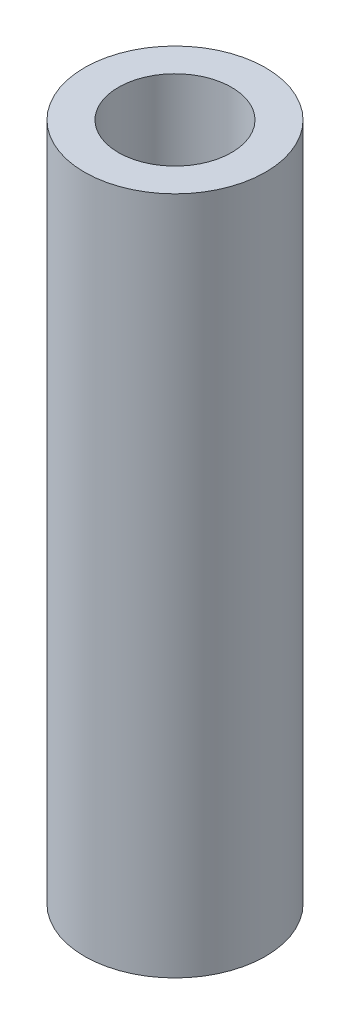
ISO-10303-21;
HEADER;
FILE_DESCRIPTION(('STEP AP214'),'2;1');
FILE_NAME('part.step','',(''),(''),'','','');
FILE_SCHEMA(('AUTOMOTIVE_DESIGN { 1 0 10303 214 1 1 1 1 }'));
ENDSEC;
DATA;
#1=APPLICATION_CONTEXT('core data for automotive mechanical design processes');
#2=APPLICATION_PROTOCOL_DEFINITION('international standard','automotive_design',2000,#1);
#3=PRODUCT_CONTEXT('',#1,'mechanical');
#4=PRODUCT('Part','Part','',(#3));
#5=PRODUCT_RELATED_PRODUCT_CATEGORY('part','',(#4));
#6=PRODUCT_DEFINITION_FORMATION('','',#4);
#7=PRODUCT_DEFINITION_CONTEXT('part definition',#1,'design');
#8=PRODUCT_DEFINITION('design','',#6,#7);
#9=PRODUCT_DEFINITION_SHAPE('','',#8);
#10=(LENGTH_UNIT() NAMED_UNIT(*) SI_UNIT(.MILLI.,.METRE.));
#11=(NAMED_UNIT(*) PLANE_ANGLE_UNIT() SI_UNIT($,.RADIAN.));
#12=(NAMED_UNIT(*) SI_UNIT($,.STERADIAN.) SOLID_ANGLE_UNIT());
#13=UNCERTAINTY_MEASURE_WITH_UNIT(LENGTH_MEASURE(1.E-05),#10,'distance_accuracy_value','');
#14=(GEOMETRIC_REPRESENTATION_CONTEXT(3) GLOBAL_UNCERTAINTY_ASSIGNED_CONTEXT((#13)) GLOBAL_UNIT_ASSIGNED_CONTEXT((#10,
#11,#12)) REPRESENTATION_CONTEXT('',''));
#15=CARTESIAN_POINT('',(0.,0.,0.));
#16=DIRECTION('',(0.,0.,1.));
#17=DIRECTION('',(1.,0.,0.));
#18=AXIS2_PLACEMENT_3D('',#15,#16,#17);
#19=CARTESIAN_POINT('',(0.,15.,0.));
#20=DIRECTION('',(0.,1.,0.));
#21=DIRECTION('',(0.,0.,1.));
#22=AXIS2_PLACEMENT_3D('',#19,#20,#21);
#23=PLANE('',#22);
#24=CARTESIAN_POINT('',(0.,15.,0.));
#25=DIRECTION('',(0.,1.,0.));
#26=DIRECTION('',(0.,0.,1.));
#27=AXIS2_PLACEMENT_3D('',#24,#25,#26);
#28=CIRCLE('',#27,2.);
#29=CARTESIAN_POINT('',(0.,15.,2.));
#30=VERTEX_POINT('',#29);
#31=EDGE_CURVE('E10',#30,#30,#28,.T.);
#32=ORIENTED_EDGE('',*,*,#31,.T.);
#33=EDGE_LOOP('',(#32));
#34=FACE_BOUND('',#33,.T.);
#35=CARTESIAN_POINT('',(0.,15.,0.));
#36=DIRECTION('',(0.,1.,0.));
#37=DIRECTION('',(0.,0.,1.));
#38=AXIS2_PLACEMENT_3D('',#35,#36,#37);
#39=CIRCLE('',#38,1.25);
#40=CARTESIAN_POINT('',(0.,15.,1.25));
#41=VERTEX_POINT('',#40);
#42=EDGE_CURVE('E53',#41,#41,#39,.T.);
#43=ORIENTED_EDGE('',*,*,#42,.F.);
#44=EDGE_LOOP('',(#43));
#45=FACE_BOUND('',#44,.T.);
#46=ADVANCED_FACE('F40',(#34,#45),#23,.T.);
#47=CARTESIAN_POINT('',(0.,0.,0.));
#48=DIRECTION('',(0.,1.,0.));
#49=DIRECTION('',(0.,0.,1.));
#50=AXIS2_PLACEMENT_3D('',#47,#48,#49);
#51=PLANE('',#50);
#52=CARTESIAN_POINT('',(0.,0.,0.));
#53=DIRECTION('',(0.,1.,0.));
#54=DIRECTION('',(0.,0.,1.));
#55=AXIS2_PLACEMENT_3D('',#52,#53,#54);
#56=CIRCLE('',#55,2.);
#57=CARTESIAN_POINT('',(0.,0.,2.));
#58=VERTEX_POINT('',#57);
#59=EDGE_CURVE('E44',#58,#58,#56,.T.);
#60=ORIENTED_EDGE('',*,*,#59,.F.);
#61=EDGE_LOOP('',(#60));
#62=FACE_BOUND('',#61,.T.);
#63=CARTESIAN_POINT('',(0.,0.,0.));
#64=DIRECTION('',(0.,1.,0.));
#65=DIRECTION('',(0.,0.,1.));
#66=AXIS2_PLACEMENT_3D('',#63,#64,#65);
#67=CIRCLE('',#66,1.25);
#68=CARTESIAN_POINT('',(0.,0.,1.25));
#69=VERTEX_POINT('',#68);
#70=EDGE_CURVE('E55',#69,#69,#67,.T.);
#71=ORIENTED_EDGE('',*,*,#70,.T.);
#72=EDGE_LOOP('',(#71));
#73=FACE_BOUND('',#72,.T.);
#74=ADVANCED_FACE('F67',(#62,#73),#51,.F.);
#75=CARTESIAN_POINT('',(0.,15.,0.));
#76=DIRECTION('',(0.,-1.,0.));
#77=DIRECTION('',(0.,0.,-1.));
#78=AXIS2_PLACEMENT_3D('',#75,#76,#77);
#79=CYLINDRICAL_SURFACE('',#78,2.);
#80=ORIENTED_EDGE('',*,*,#31,.F.);
#81=EDGE_LOOP('',(#80));
#82=FACE_BOUND('',#81,.T.);
#83=ORIENTED_EDGE('',*,*,#59,.T.);
#84=EDGE_LOOP('',(#83));
#85=FACE_BOUND('',#84,.T.);
#86=ADVANCED_FACE('F42',(#82,#85),#79,.T.);
#87=CARTESIAN_POINT('',(0.,15.,0.));
#88=DIRECTION('',(0.,-1.,0.));
#89=DIRECTION('',(0.,0.,-1.));
#90=AXIS2_PLACEMENT_3D('',#87,#88,#89);
#91=CYLINDRICAL_SURFACE('',#90,1.25);
#92=ORIENTED_EDGE('',*,*,#42,.T.);
#93=EDGE_LOOP('',(#92));
#94=FACE_BOUND('',#93,.T.);
#95=ORIENTED_EDGE('',*,*,#70,.F.);
#96=EDGE_LOOP('',(#95));
#97=FACE_BOUND('',#96,.T.);
#98=ADVANCED_FACE('F63',(#94,#97),#91,.F.);
#99=CLOSED_SHELL('',(#46,#74,#86,#98));
#100=MANIFOLD_SOLID_BREP('B2',#99);
#101=ADVANCED_BREP_SHAPE_REPRESENTATION('',(#18,#100),#14);
#102=SHAPE_DEFINITION_REPRESENTATION(#9,#101);
ENDSEC;
END-ISO-10303-21;
